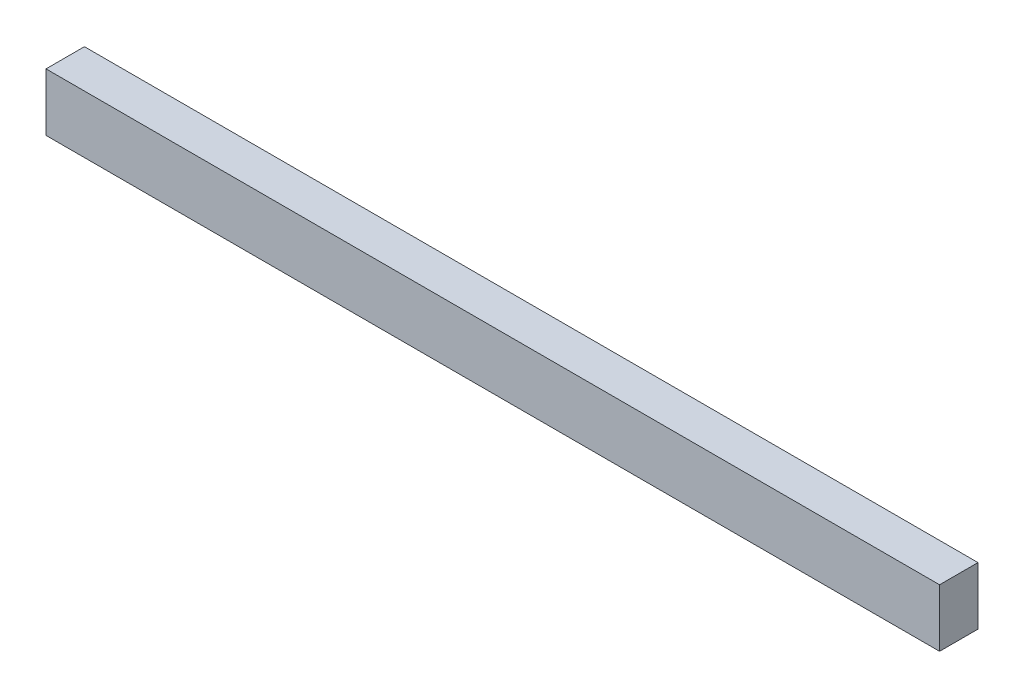
ISO-10303-21;
HEADER;
FILE_DESCRIPTION(('STEP AP214'),'2;1');
FILE_NAME('part.step','',(''),(''),'','','');
FILE_SCHEMA(('AUTOMOTIVE_DESIGN { 1 0 10303 214 1 1 1 1 }'));
ENDSEC;
DATA;
#1=APPLICATION_CONTEXT('core data for automotive mechanical design processes');
#2=APPLICATION_PROTOCOL_DEFINITION('international standard','automotive_design',2000,#1);
#3=PRODUCT_CONTEXT('',#1,'mechanical');
#4=PRODUCT('Part','Part','',(#3));
#5=PRODUCT_RELATED_PRODUCT_CATEGORY('part','',(#4));
#6=PRODUCT_DEFINITION_FORMATION('','',#4);
#7=PRODUCT_DEFINITION_CONTEXT('part definition',#1,'design');
#8=PRODUCT_DEFINITION('design','',#6,#7);
#9=PRODUCT_DEFINITION_SHAPE('','',#8);
#10=(LENGTH_UNIT() NAMED_UNIT(*) SI_UNIT(.MILLI.,.METRE.));
#11=(NAMED_UNIT(*) PLANE_ANGLE_UNIT() SI_UNIT($,.RADIAN.));
#12=(NAMED_UNIT(*) SI_UNIT($,.STERADIAN.) SOLID_ANGLE_UNIT());
#13=UNCERTAINTY_MEASURE_WITH_UNIT(LENGTH_MEASURE(1.E-05),#10,'distance_accuracy_value','');
#14=(GEOMETRIC_REPRESENTATION_CONTEXT(3) GLOBAL_UNCERTAINTY_ASSIGNED_CONTEXT((#13)) GLOBAL_UNIT_ASSIGNED_CONTEXT((#10,
#11,#12)) REPRESENTATION_CONTEXT('',''));
#15=CARTESIAN_POINT('',(0.,0.,0.));
#16=DIRECTION('',(0.,0.,1.));
#17=DIRECTION('',(1.,0.,0.));
#18=AXIS2_PLACEMENT_3D('',#15,#16,#17);
#19=CARTESIAN_POINT('',(295.275,38.1,12.7));
#20=DIRECTION('',(-1.,0.,0.));
#21=DIRECTION('',(0.,0.,1.));
#22=AXIS2_PLACEMENT_3D('',#19,#20,#21);
#23=PLANE('',#22);
#24=DIRECTION('',(0.,0.,-1.));
#25=VECTOR('',#24,1.);
#26=CARTESIAN_POINT('',(295.275,0.,12.7));
#27=LINE('',#26,#25);
#28=CARTESIAN_POINT('',(295.275,0.,12.7));
#29=VERTEX_POINT('',#28);
#30=CARTESIAN_POINT('',(295.275,0.,-12.7));
#31=VERTEX_POINT('',#30);
#32=EDGE_CURVE('E202',#29,#31,#27,.T.);
#33=ORIENTED_EDGE('',*,*,#32,.T.);
#34=DIRECTION('',(0.,-1.,0.));
#35=VECTOR('',#34,1.);
#36=CARTESIAN_POINT('',(295.275,38.1,-12.7));
#37=LINE('',#36,#35);
#38=CARTESIAN_POINT('',(295.275,38.1,-12.7));
#39=VERTEX_POINT('',#38);
#40=EDGE_CURVE('E11',#39,#31,#37,.T.);
#41=ORIENTED_EDGE('',*,*,#40,.F.);
#42=DIRECTION('',(0.,0.,-1.));
#43=VECTOR('',#42,1.);
#44=CARTESIAN_POINT('',(295.275,38.1,12.7));
#45=LINE('',#44,#43);
#46=CARTESIAN_POINT('',(295.275,38.1,12.7));
#47=VERTEX_POINT('',#46);
#48=EDGE_CURVE('E203',#47,#39,#45,.T.);
#49=ORIENTED_EDGE('',*,*,#48,.F.);
#50=DIRECTION('',(0.,-1.,0.));
#51=VECTOR('',#50,1.);
#52=CARTESIAN_POINT('',(295.275,38.1,12.7));
#53=LINE('',#52,#51);
#54=EDGE_CURVE('E213',#47,#29,#53,.T.);
#55=ORIENTED_EDGE('',*,*,#54,.T.);
#56=EDGE_LOOP('',(#33,#41,#49,#55));
#57=FACE_BOUND('',#56,.T.);
#58=ADVANCED_FACE('F45',(#57),#23,.F.);
#59=CARTESIAN_POINT('',(-295.275,38.1,-12.7));
#60=DIRECTION('',(0.,0.,1.));
#61=DIRECTION('',(1.,0.,0.));
#62=AXIS2_PLACEMENT_3D('',#59,#60,#61);
#63=PLANE('',#62);
#64=DIRECTION('',(-1.,0.,0.));
#65=VECTOR('',#64,1.);
#66=CARTESIAN_POINT('',(-295.275,0.,-12.7));
#67=LINE('',#66,#65);
#68=CARTESIAN_POINT('',(-295.275,0.,-12.7));
#69=VERTEX_POINT('',#68);
#70=EDGE_CURVE('E217',#31,#69,#67,.T.);
#71=ORIENTED_EDGE('',*,*,#70,.T.);
#72=DIRECTION('',(0.,-1.,0.));
#73=VECTOR('',#72,1.);
#74=CARTESIAN_POINT('',(-295.275,38.1,-12.7));
#75=LINE('',#74,#73);
#76=CARTESIAN_POINT('',(-295.275,38.1,-12.7));
#77=VERTEX_POINT('',#76);
#78=EDGE_CURVE('E54',#77,#69,#75,.T.);
#79=ORIENTED_EDGE('',*,*,#78,.F.);
#80=DIRECTION('',(-1.,0.,0.));
#81=VECTOR('',#80,1.);
#82=CARTESIAN_POINT('',(-295.275,38.1,-12.7));
#83=LINE('',#82,#81);
#84=EDGE_CURVE('E93',#39,#77,#83,.T.);
#85=ORIENTED_EDGE('',*,*,#84,.F.);
#86=ORIENTED_EDGE('',*,*,#40,.T.);
#87=EDGE_LOOP('',(#71,#79,#85,#86));
#88=FACE_BOUND('',#87,.T.);
#89=ADVANCED_FACE('F246',(#88),#63,.F.);
#90=CARTESIAN_POINT('',(-295.275,38.1,12.7));
#91=DIRECTION('',(1.,0.,0.));
#92=DIRECTION('',(0.,0.,-1.));
#93=AXIS2_PLACEMENT_3D('',#90,#91,#92);
#94=PLANE('',#93);
#95=DIRECTION('',(0.,0.,1.));
#96=VECTOR('',#95,1.);
#97=CARTESIAN_POINT('',(-295.275,0.,12.7));
#98=LINE('',#97,#96);
#99=CARTESIAN_POINT('',(-295.275,0.,12.7));
#100=VERTEX_POINT('',#99);
#101=EDGE_CURVE('E80',#69,#100,#98,.T.);
#102=ORIENTED_EDGE('',*,*,#101,.T.);
#103=DIRECTION('',(0.,-1.,0.));
#104=VECTOR('',#103,1.);
#105=CARTESIAN_POINT('',(-295.275,38.1,12.7));
#106=LINE('',#105,#104);
#107=CARTESIAN_POINT('',(-295.275,38.1,12.7));
#108=VERTEX_POINT('',#107);
#109=EDGE_CURVE('E226',#108,#100,#106,.T.);
#110=ORIENTED_EDGE('',*,*,#109,.F.);
#111=DIRECTION('',(0.,0.,1.));
#112=VECTOR('',#111,1.);
#113=CARTESIAN_POINT('',(-295.275,38.1,12.7));
#114=LINE('',#113,#112);
#115=EDGE_CURVE('E208',#77,#108,#114,.T.);
#116=ORIENTED_EDGE('',*,*,#115,.F.);
#117=ORIENTED_EDGE('',*,*,#78,.T.);
#118=EDGE_LOOP('',(#102,#110,#116,#117));
#119=FACE_BOUND('',#118,.T.);
#120=ADVANCED_FACE('F230',(#119),#94,.F.);
#121=CARTESIAN_POINT('',(-295.275,38.1,12.7));
#122=DIRECTION('',(0.,0.,-1.));
#123=DIRECTION('',(-1.,0.,0.));
#124=AXIS2_PLACEMENT_3D('',#121,#122,#123);
#125=PLANE('',#124);
#126=DIRECTION('',(1.,0.,0.));
#127=VECTOR('',#126,1.);
#128=CARTESIAN_POINT('',(-295.275,0.,12.7));
#129=LINE('',#128,#127);
#130=EDGE_CURVE('E86',#100,#29,#129,.T.);
#131=ORIENTED_EDGE('',*,*,#130,.T.);
#132=ORIENTED_EDGE('',*,*,#54,.F.);
#133=DIRECTION('',(1.,0.,0.));
#134=VECTOR('',#133,1.);
#135=CARTESIAN_POINT('',(-295.275,38.1,12.7));
#136=LINE('',#135,#134);
#137=EDGE_CURVE('E62',#108,#47,#136,.T.);
#138=ORIENTED_EDGE('',*,*,#137,.F.);
#139=ORIENTED_EDGE('',*,*,#109,.T.);
#140=EDGE_LOOP('',(#131,#132,#138,#139));
#141=FACE_BOUND('',#140,.T.);
#142=ADVANCED_FACE('F237',(#141),#125,.F.);
#143=CARTESIAN_POINT('',(0.,38.1,0.));
#144=DIRECTION('',(0.,-1.,0.));
#145=DIRECTION('',(0.,0.,-1.));
#146=AXIS2_PLACEMENT_3D('',#143,#144,#145);
#147=PLANE('',#146);
#148=ORIENTED_EDGE('',*,*,#48,.T.);
#149=ORIENTED_EDGE('',*,*,#84,.T.);
#150=ORIENTED_EDGE('',*,*,#115,.T.);
#151=ORIENTED_EDGE('',*,*,#137,.T.);
#152=EDGE_LOOP('',(#148,#149,#150,#151));
#153=FACE_BOUND('',#152,.T.);
#154=ADVANCED_FACE('F239',(#153),#147,.F.);
#155=CARTESIAN_POINT('',(0.,0.,0.));
#156=DIRECTION('',(0.,-1.,0.));
#157=DIRECTION('',(0.,0.,-1.));
#158=AXIS2_PLACEMENT_3D('',#155,#156,#157);
#159=PLANE('',#158);
#160=CARTESIAN_POINT('',(269.875,0.,6.35));
#161=DIRECTION('',(0.,-1.,0.));
#162=DIRECTION('',(0.,0.,-1.));
#163=AXIS2_PLACEMENT_3D('',#160,#161,#162);
#164=CIRCLE('',#163,3.80999999999998);
#165=CARTESIAN_POINT('',(269.875,0.,2.54000000000002));
#166=VERTEX_POINT('',#165);
#167=EDGE_CURVE('E133',#166,#166,#164,.T.);
#168=ORIENTED_EDGE('',*,*,#167,.F.);
#169=EDGE_LOOP('',(#168));
#170=FACE_BOUND('',#169,.T.);
#171=CARTESIAN_POINT('',(212.725,0.,6.3499999999996));
#172=DIRECTION('',(0.,-1.,0.));
#173=DIRECTION('',(0.,0.,-1.));
#174=AXIS2_PLACEMENT_3D('',#171,#172,#173);
#175=CIRCLE('',#174,3.80999999999998);
#176=CARTESIAN_POINT('',(212.725,0.,2.53999999999962));
#177=VERTEX_POINT('',#176);
#178=EDGE_CURVE('E132',#177,#177,#175,.T.);
#179=ORIENTED_EDGE('',*,*,#178,.F.);
#180=EDGE_LOOP('',(#179));
#181=FACE_BOUND('',#180,.T.);
#182=CARTESIAN_POINT('',(155.575,0.,6.3499999999992));
#183=DIRECTION('',(0.,-1.,0.));
#184=DIRECTION('',(0.,0.,-1.));
#185=AXIS2_PLACEMENT_3D('',#182,#183,#184);
#186=CIRCLE('',#185,3.80999999999998);
#187=CARTESIAN_POINT('',(155.575,0.,2.53999999999922));
#188=VERTEX_POINT('',#187);
#189=EDGE_CURVE('E146',#188,#188,#186,.T.);
#190=ORIENTED_EDGE('',*,*,#189,.F.);
#191=EDGE_LOOP('',(#190));
#192=FACE_BOUND('',#191,.T.);
#193=CARTESIAN_POINT('',(-142.875,0.,6.34999999999801));
#194=DIRECTION('',(0.,-1.,0.));
#195=DIRECTION('',(0.,0.,-1.));
#196=AXIS2_PLACEMENT_3D('',#193,#194,#195);
#197=CIRCLE('',#196,3.80999999999998);
#198=CARTESIAN_POINT('',(-142.875,0.,2.53999999999803));
#199=VERTEX_POINT('',#198);
#200=EDGE_CURVE('E154',#199,#199,#197,.T.);
#201=ORIENTED_EDGE('',*,*,#200,.F.);
#202=EDGE_LOOP('',(#201));
#203=FACE_BOUND('',#202,.T.);
#204=CARTESIAN_POINT('',(98.425,0.,6.3499999999988));
#205=DIRECTION('',(0.,-1.,0.));
#206=DIRECTION('',(0.,0.,-1.));
#207=AXIS2_PLACEMENT_3D('',#204,#205,#206);
#208=CIRCLE('',#207,3.80999999999999);
#209=CARTESIAN_POINT('',(98.425,0.,2.53999999999881));
#210=VERTEX_POINT('',#209);
#211=EDGE_CURVE('E162',#210,#210,#208,.T.);
#212=ORIENTED_EDGE('',*,*,#211,.F.);
#213=EDGE_LOOP('',(#212));
#214=FACE_BOUND('',#213,.T.);
#215=CARTESIAN_POINT('',(41.275,0.,6.34999999999841));
#216=DIRECTION('',(0.,-1.,0.));
#217=DIRECTION('',(0.,0.,-1.));
#218=AXIS2_PLACEMENT_3D('',#215,#216,#217);
#219=CIRCLE('',#218,3.80999999999999);
#220=CARTESIAN_POINT('',(41.275,0.,2.53999999999842));
#221=VERTEX_POINT('',#220);
#222=EDGE_CURVE('E170',#221,#221,#219,.T.);
#223=ORIENTED_EDGE('',*,*,#222,.F.);
#224=EDGE_LOOP('',(#223));
#225=FACE_BOUND('',#224,.T.);
#226=CARTESIAN_POINT('',(-15.875,0.,6.34999999999801));
#227=DIRECTION('',(0.,-1.,0.));
#228=DIRECTION('',(0.,0.,-1.));
#229=AXIS2_PLACEMENT_3D('',#226,#227,#228);
#230=CIRCLE('',#229,3.80999999999999);
#231=CARTESIAN_POINT('',(-15.875,0.,2.53999999999802));
#232=VERTEX_POINT('',#231);
#233=EDGE_CURVE('E178',#232,#232,#230,.T.);
#234=ORIENTED_EDGE('',*,*,#233,.F.);
#235=EDGE_LOOP('',(#234));
#236=FACE_BOUND('',#235,.T.);
#237=CARTESIAN_POINT('',(-200.025,0.,6.34999999999801));
#238=DIRECTION('',(0.,-1.,0.));
#239=DIRECTION('',(0.,0.,-1.));
#240=AXIS2_PLACEMENT_3D('',#237,#238,#239);
#241=CIRCLE('',#240,3.80999999999998);
#242=CARTESIAN_POINT('',(-200.025,0.,2.53999999999803));
#243=VERTEX_POINT('',#242);
#244=EDGE_CURVE('E186',#243,#243,#241,.T.);
#245=ORIENTED_EDGE('',*,*,#244,.F.);
#246=EDGE_LOOP('',(#245));
#247=FACE_BOUND('',#246,.T.);
#248=CARTESIAN_POINT('',(-257.175,0.,6.34999999999801));
#249=DIRECTION('',(0.,-1.,0.));
#250=DIRECTION('',(0.,0.,-1.));
#251=AXIS2_PLACEMENT_3D('',#248,#249,#250);
#252=CIRCLE('',#251,3.80999999999998);
#253=CARTESIAN_POINT('',(-257.175,0.,2.53999999999803));
#254=VERTEX_POINT('',#253);
#255=EDGE_CURVE('E194',#254,#254,#252,.T.);
#256=ORIENTED_EDGE('',*,*,#255,.F.);
#257=EDGE_LOOP('',(#256));
#258=FACE_BOUND('',#257,.T.);
#259=ORIENTED_EDGE('',*,*,#32,.F.);
#260=ORIENTED_EDGE('',*,*,#130,.F.);
#261=ORIENTED_EDGE('',*,*,#101,.F.);
#262=ORIENTED_EDGE('',*,*,#70,.F.);
#263=EDGE_LOOP('',(#259,#260,#261,#262));
#264=FACE_BOUND('',#263,.T.);
#265=ADVANCED_FACE('F233',(#170,#181,#192,#203,#214,#225,#236,#247,#258,#264),#159,.T.);
#266=CARTESIAN_POINT('',(-257.175,25.4,6.34999999999801));
#267=DIRECTION('',(0.,-1.,0.));
#268=DIRECTION('',(0.,0.,-1.));
#269=AXIS2_PLACEMENT_3D('',#266,#267,#268);
#270=CONICAL_SURFACE('',#269,3.80999999999998,1.02974425867665);
#271=CARTESIAN_POINT('',(-257.175,27.689278958495,6.34999999999801));
#272=VERTEX_POINT('',#271);
#273=VERTEX_LOOP('',#272);
#274=FACE_BOUND('',#273,.T.);
#275=CARTESIAN_POINT('',(-257.175,25.4,6.34999999999801));
#276=DIRECTION('',(0.,-1.,0.));
#277=DIRECTION('',(0.,0.,-1.));
#278=AXIS2_PLACEMENT_3D('',#275,#276,#277);
#279=CIRCLE('',#278,3.80999999999998);
#280=CARTESIAN_POINT('',(-257.175,25.4,2.53999999999803));
#281=VERTEX_POINT('',#280);
#282=EDGE_CURVE('E198',#281,#281,#279,.T.);
#283=ORIENTED_EDGE('',*,*,#282,.T.);
#284=EDGE_LOOP('',(#283));
#285=FACE_BOUND('',#284,.T.);
#286=ADVANCED_FACE('F280',(#274,#285),#270,.F.);
#287=CARTESIAN_POINT('',(-257.175,0.,6.34999999999801));
#288=DIRECTION('',(0.,-1.,0.));
#289=DIRECTION('',(0.,0.,-1.));
#290=AXIS2_PLACEMENT_3D('',#287,#288,#289);
#291=CYLINDRICAL_SURFACE('',#290,3.80999999999998);
#292=ORIENTED_EDGE('',*,*,#282,.F.);
#293=EDGE_LOOP('',(#292));
#294=FACE_BOUND('',#293,.T.);
#295=ORIENTED_EDGE('',*,*,#255,.T.);
#296=EDGE_LOOP('',(#295));
#297=FACE_BOUND('',#296,.T.);
#298=ADVANCED_FACE('F289',(#294,#297),#291,.F.);
#299=CARTESIAN_POINT('',(-200.025,25.4,6.34999999999801));
#300=DIRECTION('',(0.,-1.,0.));
#301=DIRECTION('',(0.,0.,-1.));
#302=AXIS2_PLACEMENT_3D('',#299,#300,#301);
#303=CONICAL_SURFACE('',#302,3.80999999999998,1.02974425867665);
#304=CARTESIAN_POINT('',(-200.025,27.689278958495,6.34999999999801));
#305=VERTEX_POINT('',#304);
#306=VERTEX_LOOP('',#305);
#307=FACE_BOUND('',#306,.T.);
#308=CARTESIAN_POINT('',(-200.025,25.4,6.34999999999801));
#309=DIRECTION('',(0.,-1.,0.));
#310=DIRECTION('',(0.,0.,-1.));
#311=AXIS2_PLACEMENT_3D('',#308,#309,#310);
#312=CIRCLE('',#311,3.80999999999998);
#313=CARTESIAN_POINT('',(-200.025,25.4,2.53999999999803));
#314=VERTEX_POINT('',#313);
#315=EDGE_CURVE('E190',#314,#314,#312,.T.);
#316=ORIENTED_EDGE('',*,*,#315,.T.);
#317=EDGE_LOOP('',(#316));
#318=FACE_BOUND('',#317,.T.);
#319=ADVANCED_FACE('F299',(#307,#318),#303,.F.);
#320=CARTESIAN_POINT('',(-200.025,0.,6.34999999999801));
#321=DIRECTION('',(0.,-1.,0.));
#322=DIRECTION('',(0.,0.,-1.));
#323=AXIS2_PLACEMENT_3D('',#320,#321,#322);
#324=CYLINDRICAL_SURFACE('',#323,3.80999999999998);
#325=ORIENTED_EDGE('',*,*,#315,.F.);
#326=EDGE_LOOP('',(#325));
#327=FACE_BOUND('',#326,.T.);
#328=ORIENTED_EDGE('',*,*,#244,.T.);
#329=EDGE_LOOP('',(#328));
#330=FACE_BOUND('',#329,.T.);
#331=ADVANCED_FACE('F309',(#327,#330),#324,.F.);
#332=CARTESIAN_POINT('',(-15.875,25.4,6.34999999999801));
#333=DIRECTION('',(0.,-1.,0.));
#334=DIRECTION('',(0.,0.,-1.));
#335=AXIS2_PLACEMENT_3D('',#332,#333,#334);
#336=CONICAL_SURFACE('',#335,3.80999999999999,1.02974425867665);
#337=CARTESIAN_POINT('',(-15.875,27.689278958495,6.34999999999801));
#338=VERTEX_POINT('',#337);
#339=VERTEX_LOOP('',#338);
#340=FACE_BOUND('',#339,.T.);
#341=CARTESIAN_POINT('',(-15.875,25.4,6.34999999999801));
#342=DIRECTION('',(0.,-1.,0.));
#343=DIRECTION('',(0.,0.,-1.));
#344=AXIS2_PLACEMENT_3D('',#341,#342,#343);
#345=CIRCLE('',#344,3.80999999999999);
#346=CARTESIAN_POINT('',(-15.875,25.4,2.53999999999801));
#347=VERTEX_POINT('',#346);
#348=EDGE_CURVE('E182',#347,#347,#345,.T.);
#349=ORIENTED_EDGE('',*,*,#348,.T.);
#350=EDGE_LOOP('',(#349));
#351=FACE_BOUND('',#350,.T.);
#352=ADVANCED_FACE('F319',(#340,#351),#336,.F.);
#353=CARTESIAN_POINT('',(-15.875,0.,6.34999999999801));
#354=DIRECTION('',(0.,-1.,0.));
#355=DIRECTION('',(0.,0.,-1.));
#356=AXIS2_PLACEMENT_3D('',#353,#354,#355);
#357=CYLINDRICAL_SURFACE('',#356,3.80999999999999);
#358=ORIENTED_EDGE('',*,*,#348,.F.);
#359=EDGE_LOOP('',(#358));
#360=FACE_BOUND('',#359,.T.);
#361=ORIENTED_EDGE('',*,*,#233,.T.);
#362=EDGE_LOOP('',(#361));
#363=FACE_BOUND('',#362,.T.);
#364=ADVANCED_FACE('F329',(#360,#363),#357,.F.);
#365=CARTESIAN_POINT('',(41.275,25.4,6.34999999999841));
#366=DIRECTION('',(0.,-1.,0.));
#367=DIRECTION('',(0.,0.,-1.));
#368=AXIS2_PLACEMENT_3D('',#365,#366,#367);
#369=CONICAL_SURFACE('',#368,3.80999999999999,1.02974425867665);
#370=CARTESIAN_POINT('',(41.275,27.689278958495,6.34999999999841));
#371=VERTEX_POINT('',#370);
#372=VERTEX_LOOP('',#371);
#373=FACE_BOUND('',#372,.T.);
#374=CARTESIAN_POINT('',(41.275,25.4,6.34999999999841));
#375=DIRECTION('',(0.,-1.,0.));
#376=DIRECTION('',(0.,0.,-1.));
#377=AXIS2_PLACEMENT_3D('',#374,#375,#376);
#378=CIRCLE('',#377,3.80999999999999);
#379=CARTESIAN_POINT('',(41.275,25.4,2.53999999999841));
#380=VERTEX_POINT('',#379);
#381=EDGE_CURVE('E174',#380,#380,#378,.T.);
#382=ORIENTED_EDGE('',*,*,#381,.T.);
#383=EDGE_LOOP('',(#382));
#384=FACE_BOUND('',#383,.T.);
#385=ADVANCED_FACE('F339',(#373,#384),#369,.F.);
#386=CARTESIAN_POINT('',(41.275,0.,6.34999999999841));
#387=DIRECTION('',(0.,-1.,0.));
#388=DIRECTION('',(0.,0.,-1.));
#389=AXIS2_PLACEMENT_3D('',#386,#387,#388);
#390=CYLINDRICAL_SURFACE('',#389,3.80999999999999);
#391=ORIENTED_EDGE('',*,*,#381,.F.);
#392=EDGE_LOOP('',(#391));
#393=FACE_BOUND('',#392,.T.);
#394=ORIENTED_EDGE('',*,*,#222,.T.);
#395=EDGE_LOOP('',(#394));
#396=FACE_BOUND('',#395,.T.);
#397=ADVANCED_FACE('F349',(#393,#396),#390,.F.);
#398=CARTESIAN_POINT('',(98.425,25.4,6.3499999999988));
#399=DIRECTION('',(0.,-1.,0.));
#400=DIRECTION('',(0.,0.,-1.));
#401=AXIS2_PLACEMENT_3D('',#398,#399,#400);
#402=CONICAL_SURFACE('',#401,3.80999999999999,1.02974425867665);
#403=CARTESIAN_POINT('',(98.425,27.689278958495,6.3499999999988));
#404=VERTEX_POINT('',#403);
#405=VERTEX_LOOP('',#404);
#406=FACE_BOUND('',#405,.T.);
#407=CARTESIAN_POINT('',(98.425,25.4,6.3499999999988));
#408=DIRECTION('',(0.,-1.,0.));
#409=DIRECTION('',(0.,0.,-1.));
#410=AXIS2_PLACEMENT_3D('',#407,#408,#409);
#411=CIRCLE('',#410,3.80999999999999);
#412=CARTESIAN_POINT('',(98.425,25.4,2.53999999999881));
#413=VERTEX_POINT('',#412);
#414=EDGE_CURVE('E166',#413,#413,#411,.T.);
#415=ORIENTED_EDGE('',*,*,#414,.T.);
#416=EDGE_LOOP('',(#415));
#417=FACE_BOUND('',#416,.T.);
#418=ADVANCED_FACE('F359',(#406,#417),#402,.F.);
#419=CARTESIAN_POINT('',(98.425,0.,6.3499999999988));
#420=DIRECTION('',(0.,-1.,0.));
#421=DIRECTION('',(0.,0.,-1.));
#422=AXIS2_PLACEMENT_3D('',#419,#420,#421);
#423=CYLINDRICAL_SURFACE('',#422,3.80999999999999);
#424=ORIENTED_EDGE('',*,*,#414,.F.);
#425=EDGE_LOOP('',(#424));
#426=FACE_BOUND('',#425,.T.);
#427=ORIENTED_EDGE('',*,*,#211,.T.);
#428=EDGE_LOOP('',(#427));
#429=FACE_BOUND('',#428,.T.);
#430=ADVANCED_FACE('F369',(#426,#429),#423,.F.);
#431=CARTESIAN_POINT('',(-142.875,25.4,6.34999999999801));
#432=DIRECTION('',(0.,-1.,0.));
#433=DIRECTION('',(0.,0.,-1.));
#434=AXIS2_PLACEMENT_3D('',#431,#432,#433);
#435=CONICAL_SURFACE('',#434,3.80999999999998,1.02974425867665);
#436=CARTESIAN_POINT('',(-142.875,27.689278958495,6.34999999999801));
#437=VERTEX_POINT('',#436);
#438=VERTEX_LOOP('',#437);
#439=FACE_BOUND('',#438,.T.);
#440=CARTESIAN_POINT('',(-142.875,25.4,6.34999999999801));
#441=DIRECTION('',(0.,-1.,0.));
#442=DIRECTION('',(0.,0.,-1.));
#443=AXIS2_PLACEMENT_3D('',#440,#441,#442);
#444=CIRCLE('',#443,3.80999999999998);
#445=CARTESIAN_POINT('',(-142.875,25.4,2.53999999999803));
#446=VERTEX_POINT('',#445);
#447=EDGE_CURVE('E158',#446,#446,#444,.T.);
#448=ORIENTED_EDGE('',*,*,#447,.T.);
#449=EDGE_LOOP('',(#448));
#450=FACE_BOUND('',#449,.T.);
#451=ADVANCED_FACE('F379',(#439,#450),#435,.F.);
#452=CARTESIAN_POINT('',(-142.875,0.,6.34999999999801));
#453=DIRECTION('',(0.,-1.,0.));
#454=DIRECTION('',(0.,0.,-1.));
#455=AXIS2_PLACEMENT_3D('',#452,#453,#454);
#456=CYLINDRICAL_SURFACE('',#455,3.80999999999998);
#457=ORIENTED_EDGE('',*,*,#447,.F.);
#458=EDGE_LOOP('',(#457));
#459=FACE_BOUND('',#458,.T.);
#460=ORIENTED_EDGE('',*,*,#200,.T.);
#461=EDGE_LOOP('',(#460));
#462=FACE_BOUND('',#461,.T.);
#463=ADVANCED_FACE('F389',(#459,#462),#456,.F.);
#464=CARTESIAN_POINT('',(155.575,25.4,6.3499999999992));
#465=DIRECTION('',(0.,-1.,0.));
#466=DIRECTION('',(0.,0.,-1.));
#467=AXIS2_PLACEMENT_3D('',#464,#465,#466);
#468=CONICAL_SURFACE('',#467,3.80999999999998,1.02974425867665);
#469=CARTESIAN_POINT('',(155.575,27.689278958495,6.3499999999992));
#470=VERTEX_POINT('',#469);
#471=VERTEX_LOOP('',#470);
#472=FACE_BOUND('',#471,.T.);
#473=CARTESIAN_POINT('',(155.575,25.4,6.3499999999992));
#474=DIRECTION('',(0.,-1.,0.));
#475=DIRECTION('',(0.,0.,-1.));
#476=AXIS2_PLACEMENT_3D('',#473,#474,#475);
#477=CIRCLE('',#476,3.80999999999998);
#478=CARTESIAN_POINT('',(155.575,25.4,2.53999999999922));
#479=VERTEX_POINT('',#478);
#480=EDGE_CURVE('E150',#479,#479,#477,.T.);
#481=ORIENTED_EDGE('',*,*,#480,.T.);
#482=EDGE_LOOP('',(#481));
#483=FACE_BOUND('',#482,.T.);
#484=ADVANCED_FACE('F399',(#472,#483),#468,.F.);
#485=CARTESIAN_POINT('',(155.575,0.,6.3499999999992));
#486=DIRECTION('',(0.,-1.,0.));
#487=DIRECTION('',(0.,0.,-1.));
#488=AXIS2_PLACEMENT_3D('',#485,#486,#487);
#489=CYLINDRICAL_SURFACE('',#488,3.80999999999998);
#490=ORIENTED_EDGE('',*,*,#480,.F.);
#491=EDGE_LOOP('',(#490));
#492=FACE_BOUND('',#491,.T.);
#493=ORIENTED_EDGE('',*,*,#189,.T.);
#494=EDGE_LOOP('',(#493));
#495=FACE_BOUND('',#494,.T.);
#496=ADVANCED_FACE('F409',(#492,#495),#489,.F.);
#497=CARTESIAN_POINT('',(212.725,25.4,6.3499999999996));
#498=DIRECTION('',(0.,-1.,0.));
#499=DIRECTION('',(0.,0.,-1.));
#500=AXIS2_PLACEMENT_3D('',#497,#498,#499);
#501=CONICAL_SURFACE('',#500,3.80999999999998,1.02974425867665);
#502=CARTESIAN_POINT('',(212.725,27.689278958495,6.3499999999996));
#503=VERTEX_POINT('',#502);
#504=VERTEX_LOOP('',#503);
#505=FACE_BOUND('',#504,.T.);
#506=CARTESIAN_POINT('',(212.725,25.4,6.3499999999996));
#507=DIRECTION('',(0.,-1.,0.));
#508=DIRECTION('',(0.,0.,-1.));
#509=AXIS2_PLACEMENT_3D('',#506,#507,#508);
#510=CIRCLE('',#509,3.80999999999998);
#511=CARTESIAN_POINT('',(212.725,25.4,2.53999999999962));
#512=VERTEX_POINT('',#511);
#513=EDGE_CURVE('E138',#512,#512,#510,.T.);
#514=ORIENTED_EDGE('',*,*,#513,.T.);
#515=EDGE_LOOP('',(#514));
#516=FACE_BOUND('',#515,.T.);
#517=ADVANCED_FACE('F419',(#505,#516),#501,.F.);
#518=CARTESIAN_POINT('',(212.725,0.,6.3499999999996));
#519=DIRECTION('',(0.,-1.,0.));
#520=DIRECTION('',(0.,0.,-1.));
#521=AXIS2_PLACEMENT_3D('',#518,#519,#520);
#522=CYLINDRICAL_SURFACE('',#521,3.80999999999998);
#523=ORIENTED_EDGE('',*,*,#513,.F.);
#524=EDGE_LOOP('',(#523));
#525=FACE_BOUND('',#524,.T.);
#526=ORIENTED_EDGE('',*,*,#178,.T.);
#527=EDGE_LOOP('',(#526));
#528=FACE_BOUND('',#527,.T.);
#529=ADVANCED_FACE('F125',(#525,#528),#522,.F.);
#530=CARTESIAN_POINT('',(269.875,25.4,6.35));
#531=DIRECTION('',(0.,-1.,0.));
#532=DIRECTION('',(0.,0.,-1.));
#533=AXIS2_PLACEMENT_3D('',#530,#531,#532);
#534=CONICAL_SURFACE('',#533,3.80999999999998,1.02974425867665);
#535=CARTESIAN_POINT('',(269.875,27.689278958495,6.35));
#536=VERTEX_POINT('',#535);
#537=VERTEX_LOOP('',#536);
#538=FACE_BOUND('',#537,.T.);
#539=CARTESIAN_POINT('',(269.875,25.4,6.35));
#540=DIRECTION('',(0.,-1.,0.));
#541=DIRECTION('',(0.,0.,-1.));
#542=AXIS2_PLACEMENT_3D('',#539,#540,#541);
#543=CIRCLE('',#542,3.80999999999998);
#544=CARTESIAN_POINT('',(269.875,25.4,2.54000000000002));
#545=VERTEX_POINT('',#544);
#546=EDGE_CURVE('E129',#545,#545,#543,.T.);
#547=ORIENTED_EDGE('',*,*,#546,.T.);
#548=EDGE_LOOP('',(#547));
#549=FACE_BOUND('',#548,.T.);
#550=ADVANCED_FACE('F121',(#538,#549),#534,.F.);
#551=CARTESIAN_POINT('',(269.875,0.,6.35));
#552=DIRECTION('',(0.,-1.,0.));
#553=DIRECTION('',(0.,0.,-1.));
#554=AXIS2_PLACEMENT_3D('',#551,#552,#553);
#555=CYLINDRICAL_SURFACE('',#554,3.80999999999998);
#556=ORIENTED_EDGE('',*,*,#546,.F.);
#557=EDGE_LOOP('',(#556));
#558=FACE_BOUND('',#557,.T.);
#559=ORIENTED_EDGE('',*,*,#167,.T.);
#560=EDGE_LOOP('',(#559));
#561=FACE_BOUND('',#560,.T.);
#562=ADVANCED_FACE('F124',(#558,#561),#555,.F.);
#563=CLOSED_SHELL('',(#58,#89,#120,#142,#154,#265,#286,#298,#319,#331,#352,#364,#385,#397,#418,
#430,#451,#463,#484,#496,#517,#529,#550,#562));
#564=MANIFOLD_SOLID_BREP('B2',#563);
#565=ADVANCED_BREP_SHAPE_REPRESENTATION('',(#18,#564),#14);
#566=SHAPE_DEFINITION_REPRESENTATION(#9,#565);
ENDSEC;
END-ISO-10303-21;
